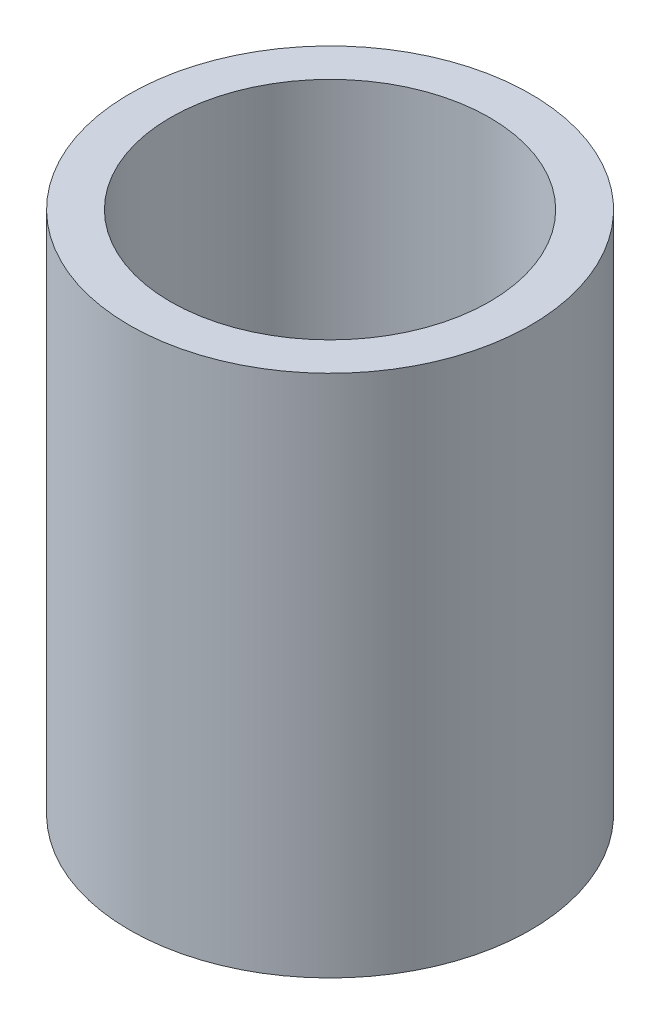
ISO-10303-21;
HEADER;
FILE_DESCRIPTION(('STEP AP214'),'2;1');
FILE_NAME('part.step','',(''),(''),'','','');
FILE_SCHEMA(('AUTOMOTIVE_DESIGN { 1 0 10303 214 1 1 1 1 }'));
ENDSEC;
DATA;
#1=APPLICATION_CONTEXT('core data for automotive mechanical design processes');
#2=APPLICATION_PROTOCOL_DEFINITION('international standard','automotive_design',2000,#1);
#3=PRODUCT_CONTEXT('',#1,'mechanical');
#4=PRODUCT('Part','Part','',(#3));
#5=PRODUCT_RELATED_PRODUCT_CATEGORY('part','',(#4));
#6=PRODUCT_DEFINITION_FORMATION('','',#4);
#7=PRODUCT_DEFINITION_CONTEXT('part definition',#1,'design');
#8=PRODUCT_DEFINITION('design','',#6,#7);
#9=PRODUCT_DEFINITION_SHAPE('','',#8);
#10=(LENGTH_UNIT() NAMED_UNIT(*) SI_UNIT(.MILLI.,.METRE.));
#11=(NAMED_UNIT(*) PLANE_ANGLE_UNIT() SI_UNIT($,.RADIAN.));
#12=(NAMED_UNIT(*) SI_UNIT($,.STERADIAN.) SOLID_ANGLE_UNIT());
#13=UNCERTAINTY_MEASURE_WITH_UNIT(LENGTH_MEASURE(1.E-05),#10,'distance_accuracy_value','');
#14=(GEOMETRIC_REPRESENTATION_CONTEXT(3) GLOBAL_UNCERTAINTY_ASSIGNED_CONTEXT((#13)) GLOBAL_UNIT_ASSIGNED_CONTEXT((#10,
#11,#12)) REPRESENTATION_CONTEXT('',''));
#15=CARTESIAN_POINT('',(0.,0.,0.));
#16=DIRECTION('',(0.,0.,1.));
#17=DIRECTION('',(1.,0.,0.));
#18=AXIS2_PLACEMENT_3D('',#15,#16,#17);
#19=CARTESIAN_POINT('',(0.,32.,0.));
#20=DIRECTION('',(0.,1.,0.));
#21=DIRECTION('',(0.,0.,1.));
#22=AXIS2_PLACEMENT_3D('',#19,#20,#21);
#23=PLANE('',#22);
#24=CARTESIAN_POINT('',(0.,32.,0.));
#25=DIRECTION('',(0.,1.,0.));
#26=DIRECTION('',(0.,0.,1.));
#27=AXIS2_PLACEMENT_3D('',#24,#25,#26);
#28=CIRCLE('',#27,24.5);
#29=CARTESIAN_POINT('',(0.,32.,24.5));
#30=VERTEX_POINT('',#29);
#31=EDGE_CURVE('E10',#30,#30,#28,.T.);
#32=ORIENTED_EDGE('',*,*,#31,.T.);
#33=EDGE_LOOP('',(#32));
#34=FACE_BOUND('',#33,.T.);
#35=CARTESIAN_POINT('',(0.,32.,0.));
#36=DIRECTION('',(0.,1.,0.));
#37=DIRECTION('',(0.,0.,1.));
#38=AXIS2_PLACEMENT_3D('',#35,#36,#37);
#39=CIRCLE('',#38,19.5);
#40=CARTESIAN_POINT('',(0.,32.,19.5));
#41=VERTEX_POINT('',#40);
#42=EDGE_CURVE('E42',#41,#41,#39,.T.);
#43=ORIENTED_EDGE('',*,*,#42,.F.);
#44=EDGE_LOOP('',(#43));
#45=FACE_BOUND('',#44,.T.);
#46=ADVANCED_FACE('F31',(#34,#45),#23,.T.);
#47=CARTESIAN_POINT('',(0.,-32.,0.));
#48=DIRECTION('',(0.,1.,0.));
#49=DIRECTION('',(0.,0.,1.));
#50=AXIS2_PLACEMENT_3D('',#47,#48,#49);
#51=PLANE('',#50);
#52=CARTESIAN_POINT('',(0.,-32.,0.));
#53=DIRECTION('',(0.,1.,0.));
#54=DIRECTION('',(0.,0.,1.));
#55=AXIS2_PLACEMENT_3D('',#52,#53,#54);
#56=CIRCLE('',#55,24.5);
#57=CARTESIAN_POINT('',(0.,-32.,24.5));
#58=VERTEX_POINT('',#57);
#59=EDGE_CURVE('E35',#58,#58,#56,.T.);
#60=ORIENTED_EDGE('',*,*,#59,.F.);
#61=EDGE_LOOP('',(#60));
#62=FACE_BOUND('',#61,.T.);
#63=CARTESIAN_POINT('',(0.,-32.,0.));
#64=DIRECTION('',(0.,1.,0.));
#65=DIRECTION('',(0.,0.,1.));
#66=AXIS2_PLACEMENT_3D('',#63,#64,#65);
#67=CIRCLE('',#66,19.5);
#68=CARTESIAN_POINT('',(0.,-32.,19.5));
#69=VERTEX_POINT('',#68);
#70=EDGE_CURVE('E44',#69,#69,#67,.T.);
#71=ORIENTED_EDGE('',*,*,#70,.T.);
#72=EDGE_LOOP('',(#71));
#73=FACE_BOUND('',#72,.T.);
#74=ADVANCED_FACE('F54',(#62,#73),#51,.F.);
#75=CARTESIAN_POINT('',(0.,32.,0.));
#76=DIRECTION('',(0.,-1.,0.));
#77=DIRECTION('',(0.,0.,-1.));
#78=AXIS2_PLACEMENT_3D('',#75,#76,#77);
#79=CYLINDRICAL_SURFACE('',#78,24.5);
#80=ORIENTED_EDGE('',*,*,#31,.F.);
#81=EDGE_LOOP('',(#80));
#82=FACE_BOUND('',#81,.T.);
#83=ORIENTED_EDGE('',*,*,#59,.T.);
#84=EDGE_LOOP('',(#83));
#85=FACE_BOUND('',#84,.T.);
#86=ADVANCED_FACE('F33',(#82,#85),#79,.T.);
#87=CARTESIAN_POINT('',(0.,32.,0.));
#88=DIRECTION('',(0.,-1.,0.));
#89=DIRECTION('',(0.,0.,-1.));
#90=AXIS2_PLACEMENT_3D('',#87,#88,#89);
#91=CYLINDRICAL_SURFACE('',#90,19.5);
#92=ORIENTED_EDGE('',*,*,#42,.T.);
#93=EDGE_LOOP('',(#92));
#94=FACE_BOUND('',#93,.T.);
#95=ORIENTED_EDGE('',*,*,#70,.F.);
#96=EDGE_LOOP('',(#95));
#97=FACE_BOUND('',#96,.T.);
#98=ADVANCED_FACE('F50',(#94,#97),#91,.F.);
#99=CLOSED_SHELL('',(#46,#74,#86,#98));
#100=MANIFOLD_SOLID_BREP('B2',#99);
#101=ADVANCED_BREP_SHAPE_REPRESENTATION('',(#18,#100),#14);
#102=SHAPE_DEFINITION_REPRESENTATION(#9,#101);
ENDSEC;
END-ISO-10303-21;
